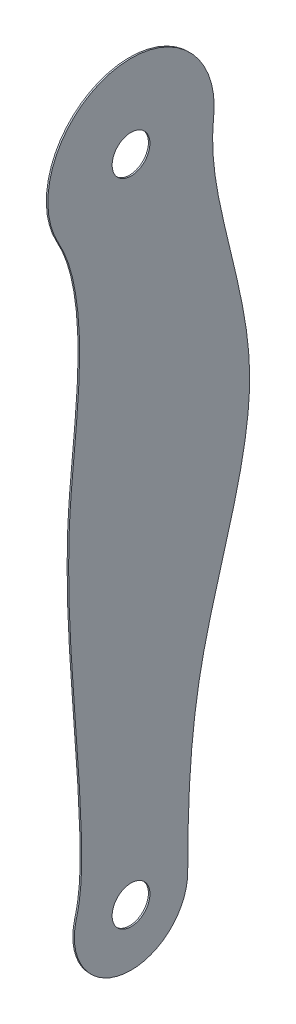
ISO-10303-21;
HEADER;
FILE_DESCRIPTION(('STEP AP214'),'2;1');
FILE_NAME('part.step','',(''),(''),'','','');
FILE_SCHEMA(('AUTOMOTIVE_DESIGN { 1 0 10303 214 1 1 1 1 }'));
ENDSEC;
DATA;
#1=APPLICATION_CONTEXT('core data for automotive mechanical design processes');
#2=APPLICATION_PROTOCOL_DEFINITION('international standard','automotive_design',2000,#1);
#3=PRODUCT_CONTEXT('',#1,'mechanical');
#4=PRODUCT('Part','Part','',(#3));
#5=PRODUCT_RELATED_PRODUCT_CATEGORY('part','',(#4));
#6=PRODUCT_DEFINITION_FORMATION('','',#4);
#7=PRODUCT_DEFINITION_CONTEXT('part definition',#1,'design');
#8=PRODUCT_DEFINITION('design','',#6,#7);
#9=PRODUCT_DEFINITION_SHAPE('','',#8);
#10=(LENGTH_UNIT() NAMED_UNIT(*) SI_UNIT(.MILLI.,.METRE.));
#11=(NAMED_UNIT(*) PLANE_ANGLE_UNIT() SI_UNIT($,.RADIAN.));
#12=(NAMED_UNIT(*) SI_UNIT($,.STERADIAN.) SOLID_ANGLE_UNIT());
#13=UNCERTAINTY_MEASURE_WITH_UNIT(LENGTH_MEASURE(1.E-05),#10,'distance_accuracy_value','');
#14=(GEOMETRIC_REPRESENTATION_CONTEXT(3) GLOBAL_UNCERTAINTY_ASSIGNED_CONTEXT((#13)) GLOBAL_UNIT_ASSIGNED_CONTEXT((#10,
#11,#12)) REPRESENTATION_CONTEXT('',''));
#15=CARTESIAN_POINT('',(0.,0.,0.));
#16=DIRECTION('',(0.,0.,1.));
#17=DIRECTION('',(1.,0.,0.));
#18=AXIS2_PLACEMENT_3D('',#15,#16,#17);
#19=CARTESIAN_POINT('',(0.5,207.374167492362,41.2499817500679));
#20=DIRECTION('',(1.,0.,0.));
#21=DIRECTION('',(0.,0.,-1.));
#22=AXIS2_PLACEMENT_3D('',#19,#20,#21);
#23=PLANE('',#22);
#24=CARTESIAN_POINT('',(0.5,430.,0.));
#25=DIRECTION('',(1.,0.,0.));
#26=DIRECTION('',(0.,0.,-1.));
#27=AXIS2_PLACEMENT_3D('',#24,#25,#26);
#28=CIRCLE('',#27,12.5);
#29=CARTESIAN_POINT('',(0.5,430.,-12.5));
#30=VERTEX_POINT('',#29);
#31=EDGE_CURVE('E146',#30,#30,#28,.T.);
#32=ORIENTED_EDGE('',*,*,#31,.F.);
#33=EDGE_LOOP('',(#32));
#34=FACE_BOUND('',#33,.T.);
#35=CARTESIAN_POINT('',(0.5,403.179074455955,48.0170589786671));
#36=CARTESIAN_POINT('',(0.5,390.817857106078,41.1124443015768));
#37=CARTESIAN_POINT('',(0.5,336.914546659004,27.9053200282452));
#38=CARTESIAN_POINT('',(0.5,219.17352784765,50.2084321204808));
#39=CARTESIAN_POINT('',(0.5,102.502128563102,32.2046326765255));
#40=CARTESIAN_POINT('',(0.5,23.7943069924032,32.4236697883215));
#41=CARTESIAN_POINT('',(0.5,9.76221588644743,36.2070316511364));
#42=B_SPLINE_CURVE_WITH_KNOTS('',3,(#35,#36,#37,#38,#39,#40,#41),.UNSPECIFIED.,.F.,.F.,(4,1,1,1,
4),(0.,0.106358981832205,0.411206468146027,0.890017974330233,1.),.UNSPECIFIED.);
#43=CARTESIAN_POINT('',(0.5,403.179074455955,48.0170589786671));
#44=VERTEX_POINT('',#43);
#45=CARTESIAN_POINT('',(0.5,9.76221588644748,36.2070316511364));
#46=VERTEX_POINT('',#45);
#47=EDGE_CURVE('E88',#44,#46,#42,.T.);
#48=ORIENTED_EDGE('',*,*,#47,.T.);
#49=CARTESIAN_POINT('',(0.5,0.,0.));
#50=DIRECTION('',(1.,0.,0.));
#51=DIRECTION('',(0.,0.,-1.));
#52=AXIS2_PLACEMENT_3D('',#49,#50,#51);
#53=CIRCLE('',#52,37.5);
#54=CARTESIAN_POINT('',(0.5,0.,-37.5));
#55=VERTEX_POINT('',#54);
#56=EDGE_CURVE('E83',#46,#55,#53,.T.);
#57=ORIENTED_EDGE('',*,*,#56,.T.);
#58=CARTESIAN_POINT('',(0.5,0.,-37.5));
#59=CARTESIAN_POINT('',(0.5,38.4930022065649,-37.5));
#60=CARTESIAN_POINT('',(0.5,127.83039093903,-40.8122562087119));
#61=CARTESIAN_POINT('',(0.5,248.146468922593,-93.7407390084582));
#62=CARTESIAN_POINT('',(0.5,350.928455024401,-61.6884301886915));
#63=CARTESIAN_POINT('',(0.5,404.859584216764,-52.5095091774371));
#64=CARTESIAN_POINT('',(0.5,423.825278240577,-54.6522900818777));
#65=B_SPLINE_CURVE_WITH_KNOTS('',3,(#58,#59,#60,#61,#62,#63,#64),.UNSPECIFIED.,.F.,.F.,(4,1,1,1,
4),(0.,0.268515101919448,0.623441236092956,0.866552798949027,1.),.UNSPECIFIED.);
#66=CARTESIAN_POINT('',(0.5,423.825278240577,-54.6522900818777));
#67=VERTEX_POINT('',#66);
#68=EDGE_CURVE('E86',#55,#67,#65,.T.);
#69=ORIENTED_EDGE('',*,*,#68,.T.);
#70=CARTESIAN_POINT('',(0.5,430.,0.));
#71=DIRECTION('',(1.,0.,0.));
#72=DIRECTION('',(0.,0.,-1.));
#73=AXIS2_PLACEMENT_3D('',#70,#71,#72);
#74=CIRCLE('',#73,55.);
#75=EDGE_CURVE('E53',#67,#44,#74,.T.);
#76=ORIENTED_EDGE('',*,*,#75,.T.);
#77=EDGE_LOOP('',(#48,#57,#69,#76));
#78=FACE_BOUND('',#77,.T.);
#79=CARTESIAN_POINT('',(0.5,0.,0.));
#80=DIRECTION('',(1.,0.,0.));
#81=DIRECTION('',(0.,0.,-1.));
#82=AXIS2_PLACEMENT_3D('',#79,#80,#81);
#83=CIRCLE('',#82,12.5);
#84=CARTESIAN_POINT('',(0.5,0.,-12.5));
#85=VERTEX_POINT('',#84);
#86=EDGE_CURVE('E137',#85,#85,#83,.T.);
#87=ORIENTED_EDGE('',*,*,#86,.F.);
#88=EDGE_LOOP('',(#87));
#89=FACE_BOUND('',#88,.T.);
#90=ADVANCED_FACE('F35',(#34,#78,#89),#23,.T.);
#91=CARTESIAN_POINT('',(-0.5,207.374167492362,41.2499817500679));
#92=DIRECTION('',(1.,0.,0.));
#93=DIRECTION('',(0.,0.,-1.));
#94=AXIS2_PLACEMENT_3D('',#91,#92,#93);
#95=PLANE('',#94);
#96=CARTESIAN_POINT('',(-0.5,403.179074455955,48.0170589786671));
#97=CARTESIAN_POINT('',(-0.5,390.817857106078,41.1124443015768));
#98=CARTESIAN_POINT('',(-0.5,336.914546659004,27.9053200282452));
#99=CARTESIAN_POINT('',(-0.5,219.17352784765,50.2084321204808));
#100=CARTESIAN_POINT('',(-0.5,102.502128563102,32.2046326765255));
#101=CARTESIAN_POINT('',(-0.5,23.7943069924032,32.4236697883215));
#102=CARTESIAN_POINT('',(-0.5,9.76221588644743,36.2070316511364));
#103=B_SPLINE_CURVE_WITH_KNOTS('',3,(#96,#97,#98,#99,#100,#101,#102),.UNSPECIFIED.,.F.,.F.,(4,1,
1,1,4),(0.,0.106358981832205,0.411206468146027,0.890017974330233,1.),.UNSPECIFIED.);
#104=CARTESIAN_POINT('',(-0.5,403.179074455955,48.0170589786671));
#105=VERTEX_POINT('',#104);
#106=CARTESIAN_POINT('',(-0.5,9.76221588644748,36.2070316511364));
#107=VERTEX_POINT('',#106);
#108=EDGE_CURVE('E149',#105,#107,#103,.T.);
#109=ORIENTED_EDGE('',*,*,#108,.F.);
#110=CARTESIAN_POINT('',(-0.5,430.,0.));
#111=DIRECTION('',(1.,0.,0.));
#112=DIRECTION('',(0.,0.,-1.));
#113=AXIS2_PLACEMENT_3D('',#110,#111,#112);
#114=CIRCLE('',#113,55.);
#115=CARTESIAN_POINT('',(-0.5,423.825278240577,-54.6522900818777));
#116=VERTEX_POINT('',#115);
#117=EDGE_CURVE('E76',#116,#105,#114,.T.);
#118=ORIENTED_EDGE('',*,*,#117,.F.);
#119=CARTESIAN_POINT('',(-0.5,0.,-37.5));
#120=CARTESIAN_POINT('',(-0.5,38.4930022065649,-37.5));
#121=CARTESIAN_POINT('',(-0.5,127.83039093903,-40.8122562087119));
#122=CARTESIAN_POINT('',(-0.5,248.146468922593,-93.7407390084582));
#123=CARTESIAN_POINT('',(-0.5,350.928455024401,-61.6884301886915));
#124=CARTESIAN_POINT('',(-0.5,404.859584216764,-52.5095091774371));
#125=CARTESIAN_POINT('',(-0.5,423.825278240577,-54.6522900818777));
#126=B_SPLINE_CURVE_WITH_KNOTS('',3,(#119,#120,#121,#122,#123,#124,#125),.UNSPECIFIED.,.F.,.F.,
(4,1,1,1,4),(0.,0.268515101919448,0.623441236092956,0.866552798949027,1.),.UNSPECIFIED.);
#127=CARTESIAN_POINT('',(-0.5,0.,-37.5));
#128=VERTEX_POINT('',#127);
#129=EDGE_CURVE('E70',#128,#116,#126,.T.);
#130=ORIENTED_EDGE('',*,*,#129,.F.);
#131=CARTESIAN_POINT('',(-0.5,0.,0.));
#132=DIRECTION('',(1.,0.,0.));
#133=DIRECTION('',(0.,0.,-1.));
#134=AXIS2_PLACEMENT_3D('',#131,#132,#133);
#135=CIRCLE('',#134,37.5);
#136=EDGE_CURVE('E92',#107,#128,#135,.T.);
#137=ORIENTED_EDGE('',*,*,#136,.F.);
#138=EDGE_LOOP('',(#109,#118,#130,#137));
#139=FACE_BOUND('',#138,.T.);
#140=CARTESIAN_POINT('',(-0.5,430.,0.));
#141=DIRECTION('',(1.,0.,0.));
#142=DIRECTION('',(0.,0.,-1.));
#143=AXIS2_PLACEMENT_3D('',#140,#141,#142);
#144=CIRCLE('',#143,12.5);
#145=CARTESIAN_POINT('',(-0.5,430.,-12.5));
#146=VERTEX_POINT('',#145);
#147=EDGE_CURVE('E143',#146,#146,#144,.T.);
#148=ORIENTED_EDGE('',*,*,#147,.T.);
#149=EDGE_LOOP('',(#148));
#150=FACE_BOUND('',#149,.T.);
#151=CARTESIAN_POINT('',(-0.5,0.,0.));
#152=DIRECTION('',(1.,0.,0.));
#153=DIRECTION('',(0.,0.,-1.));
#154=AXIS2_PLACEMENT_3D('',#151,#152,#153);
#155=CIRCLE('',#154,12.5);
#156=CARTESIAN_POINT('',(-0.5,0.,-12.5));
#157=VERTEX_POINT('',#156);
#158=EDGE_CURVE('E140',#157,#157,#155,.T.);
#159=ORIENTED_EDGE('',*,*,#158,.T.);
#160=EDGE_LOOP('',(#159));
#161=FACE_BOUND('',#160,.T.);
#162=ADVANCED_FACE('F114',(#139,#150,#161),#95,.F.);
#163=DIRECTION('',(-1.,0.,0.));
#164=VECTOR('',#163,1.);
#165=SURFACE_OF_LINEAR_EXTRUSION('',#42,#164);
#166=ORIENTED_EDGE('',*,*,#108,.T.);
#167=DIRECTION('',(-1.,0.,0.));
#168=VECTOR('',#167,1.);
#169=CARTESIAN_POINT('',(0.5,9.76221588644748,36.2070316511364));
#170=LINE('',#169,#168);
#171=EDGE_CURVE('E11',#46,#107,#170,.T.);
#172=ORIENTED_EDGE('',*,*,#171,.F.);
#173=ORIENTED_EDGE('',*,*,#47,.F.);
#174=DIRECTION('',(-1.,0.,0.));
#175=VECTOR('',#174,1.);
#176=CARTESIAN_POINT('',(0.5,403.179074455955,48.0170589786671));
#177=LINE('',#176,#175);
#178=EDGE_CURVE('E96',#44,#105,#177,.T.);
#179=ORIENTED_EDGE('',*,*,#178,.T.);
#180=EDGE_LOOP('',(#166,#172,#173,#179));
#181=FACE_BOUND('',#180,.T.);
#182=ADVANCED_FACE('F37',(#181),#165,.F.);
#183=CARTESIAN_POINT('',(0.5,0.,0.));
#184=DIRECTION('',(-1.,0.,0.));
#185=DIRECTION('',(0.,0.,1.));
#186=AXIS2_PLACEMENT_3D('',#183,#184,#185);
#187=CYLINDRICAL_SURFACE('',#186,37.5);
#188=ORIENTED_EDGE('',*,*,#136,.T.);
#189=DIRECTION('',(-1.,0.,0.));
#190=VECTOR('',#189,1.);
#191=CARTESIAN_POINT('',(0.5,0.,-37.5));
#192=LINE('',#191,#190);
#193=EDGE_CURVE('E45',#55,#128,#192,.T.);
#194=ORIENTED_EDGE('',*,*,#193,.F.);
#195=ORIENTED_EDGE('',*,*,#56,.F.);
#196=ORIENTED_EDGE('',*,*,#171,.T.);
#197=EDGE_LOOP('',(#188,#194,#195,#196));
#198=FACE_BOUND('',#197,.T.);
#199=ADVANCED_FACE('F91',(#198),#187,.T.);
#200=DIRECTION('',(-1.,0.,0.));
#201=VECTOR('',#200,1.);
#202=SURFACE_OF_LINEAR_EXTRUSION('',#65,#201);
#203=ORIENTED_EDGE('',*,*,#129,.T.);
#204=DIRECTION('',(-1.,0.,0.));
#205=VECTOR('',#204,1.);
#206=CARTESIAN_POINT('',(0.5,423.825278240577,-54.6522900818777));
#207=LINE('',#206,#205);
#208=EDGE_CURVE('E93',#67,#116,#207,.T.);
#209=ORIENTED_EDGE('',*,*,#208,.F.);
#210=ORIENTED_EDGE('',*,*,#68,.F.);
#211=ORIENTED_EDGE('',*,*,#193,.T.);
#212=EDGE_LOOP('',(#203,#209,#210,#211));
#213=FACE_BOUND('',#212,.T.);
#214=ADVANCED_FACE('F94',(#213),#202,.F.);
#215=CARTESIAN_POINT('',(0.5,430.,0.));
#216=DIRECTION('',(-1.,0.,0.));
#217=DIRECTION('',(0.,0.,1.));
#218=AXIS2_PLACEMENT_3D('',#215,#216,#217);
#219=CYLINDRICAL_SURFACE('',#218,55.);
#220=ORIENTED_EDGE('',*,*,#117,.T.);
#221=ORIENTED_EDGE('',*,*,#178,.F.);
#222=ORIENTED_EDGE('',*,*,#75,.F.);
#223=ORIENTED_EDGE('',*,*,#208,.T.);
#224=EDGE_LOOP('',(#220,#221,#222,#223));
#225=FACE_BOUND('',#224,.T.);
#226=ADVANCED_FACE('F108',(#225),#219,.T.);
#227=CARTESIAN_POINT('',(0.5,430.,0.));
#228=DIRECTION('',(-1.,0.,0.));
#229=DIRECTION('',(0.,0.,1.));
#230=AXIS2_PLACEMENT_3D('',#227,#228,#229);
#231=CYLINDRICAL_SURFACE('',#230,12.5);
#232=ORIENTED_EDGE('',*,*,#31,.T.);
#233=EDGE_LOOP('',(#232));
#234=FACE_BOUND('',#233,.T.);
#235=ORIENTED_EDGE('',*,*,#147,.F.);
#236=EDGE_LOOP('',(#235));
#237=FACE_BOUND('',#236,.T.);
#238=ADVANCED_FACE('F125',(#234,#237),#231,.F.);
#239=CARTESIAN_POINT('',(0.5,0.,0.));
#240=DIRECTION('',(-1.,0.,0.));
#241=DIRECTION('',(0.,0.,1.));
#242=AXIS2_PLACEMENT_3D('',#239,#240,#241);
#243=CYLINDRICAL_SURFACE('',#242,12.5);
#244=ORIENTED_EDGE('',*,*,#86,.T.);
#245=EDGE_LOOP('',(#244));
#246=FACE_BOUND('',#245,.T.);
#247=ORIENTED_EDGE('',*,*,#158,.F.);
#248=EDGE_LOOP('',(#247));
#249=FACE_BOUND('',#248,.T.);
#250=ADVANCED_FACE('F128',(#246,#249),#243,.F.);
#251=CLOSED_SHELL('',(#90,#162,#182,#199,#214,#226,#238,#250));
#252=MANIFOLD_SOLID_BREP('B2',#251);
#253=ADVANCED_BREP_SHAPE_REPRESENTATION('',(#18,#252),#14);
#254=SHAPE_DEFINITION_REPRESENTATION(#9,#253);
ENDSEC;
END-ISO-10303-21;
